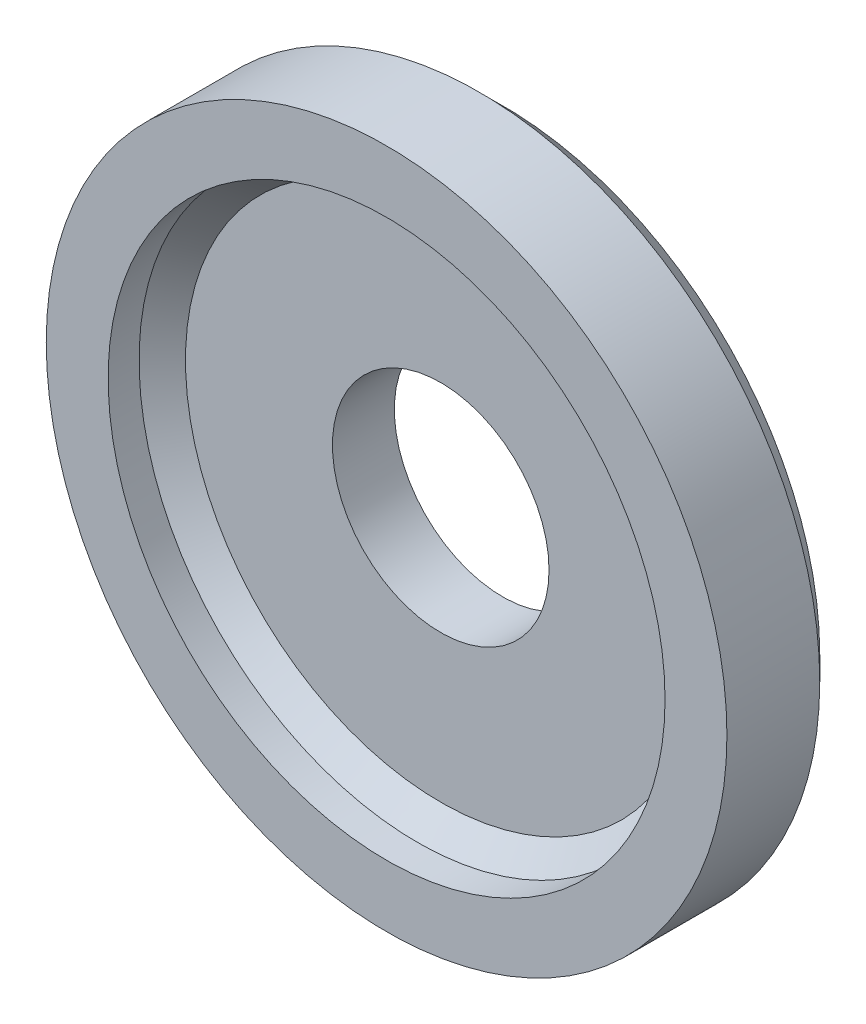
ISO-10303-21;
HEADER;
FILE_DESCRIPTION(('STEP AP214'),'2;1');
FILE_NAME('part.step','',(''),(''),'','','');
FILE_SCHEMA(('AUTOMOTIVE_DESIGN { 1 0 10303 214 1 1 1 1 }'));
ENDSEC;
DATA;
#1=APPLICATION_CONTEXT('core data for automotive mechanical design processes');
#2=APPLICATION_PROTOCOL_DEFINITION('international standard','automotive_design',2000,#1);
#3=PRODUCT_CONTEXT('',#1,'mechanical');
#4=PRODUCT('Part','Part','',(#3));
#5=PRODUCT_RELATED_PRODUCT_CATEGORY('part','',(#4));
#6=PRODUCT_DEFINITION_FORMATION('','',#4);
#7=PRODUCT_DEFINITION_CONTEXT('part definition',#1,'design');
#8=PRODUCT_DEFINITION('design','',#6,#7);
#9=PRODUCT_DEFINITION_SHAPE('','',#8);
#10=(LENGTH_UNIT() NAMED_UNIT(*) SI_UNIT(.MILLI.,.METRE.));
#11=(NAMED_UNIT(*) PLANE_ANGLE_UNIT() SI_UNIT($,.RADIAN.));
#12=(NAMED_UNIT(*) SI_UNIT($,.STERADIAN.) SOLID_ANGLE_UNIT());
#13=UNCERTAINTY_MEASURE_WITH_UNIT(LENGTH_MEASURE(1.E-05),#10,'distance_accuracy_value','');
#14=(GEOMETRIC_REPRESENTATION_CONTEXT(3) GLOBAL_UNCERTAINTY_ASSIGNED_CONTEXT((#13)) GLOBAL_UNIT_ASSIGNED_CONTEXT((#10,
#11,#12)) REPRESENTATION_CONTEXT('',''));
#15=CARTESIAN_POINT('',(0.,0.,0.));
#16=DIRECTION('',(0.,0.,1.));
#17=DIRECTION('',(1.,0.,0.));
#18=AXIS2_PLACEMENT_3D('',#15,#16,#17);
#19=CARTESIAN_POINT('',(0.,0.,3.75));
#20=DIRECTION('',(0.,0.,-1.));
#21=DIRECTION('',(-1.,0.,0.));
#22=AXIS2_PLACEMENT_3D('',#19,#20,#21);
#23=CYLINDRICAL_SURFACE('',#22,3.5);
#24=CARTESIAN_POINT('',(0.,0.,0.));
#25=DIRECTION('',(0.,0.,1.));
#26=DIRECTION('',(1.,0.,0.));
#27=AXIS2_PLACEMENT_3D('',#24,#25,#26);
#28=CIRCLE('',#27,3.5);
#29=CARTESIAN_POINT('',(3.5,0.,0.));
#30=VERTEX_POINT('',#29);
#31=EDGE_CURVE('E70',#30,#30,#28,.T.);
#32=ORIENTED_EDGE('',*,*,#31,.F.);
#33=EDGE_LOOP('',(#32));
#34=FACE_BOUND('',#33,.T.);
#35=CARTESIAN_POINT('',(0.,0.,2.));
#36=DIRECTION('',(0.,0.,1.));
#37=DIRECTION('',(1.,0.,0.));
#38=AXIS2_PLACEMENT_3D('',#35,#36,#37);
#39=CIRCLE('',#38,3.5);
#40=CARTESIAN_POINT('',(3.5,0.,2.));
#41=VERTEX_POINT('',#40);
#42=EDGE_CURVE('E67',#41,#41,#39,.T.);
#43=ORIENTED_EDGE('',*,*,#42,.T.);
#44=EDGE_LOOP('',(#43));
#45=FACE_BOUND('',#44,.T.);
#46=ADVANCED_FACE('F45',(#34,#45),#23,.F.);
#47=CARTESIAN_POINT('',(0.,0.,3.75));
#48=DIRECTION('',(0.,0.,1.));
#49=DIRECTION('',(1.,0.,0.));
#50=AXIS2_PLACEMENT_3D('',#47,#48,#49);
#51=PLANE('',#50);
#52=CARTESIAN_POINT('',(0.,0.,3.75));
#53=DIRECTION('',(0.,0.,1.));
#54=DIRECTION('',(1.,0.,0.));
#55=AXIS2_PLACEMENT_3D('',#52,#53,#54);
#56=CIRCLE('',#55,9.);
#57=CARTESIAN_POINT('',(9.,0.,3.75));
#58=VERTEX_POINT('',#57);
#59=EDGE_CURVE('E71',#58,#58,#56,.T.);
#60=ORIENTED_EDGE('',*,*,#59,.F.);
#61=EDGE_LOOP('',(#60));
#62=FACE_BOUND('',#61,.T.);
#63=CARTESIAN_POINT('',(0.,0.,3.75));
#64=DIRECTION('',(0.,0.,1.));
#65=DIRECTION('',(1.,0.,0.));
#66=AXIS2_PLACEMENT_3D('',#63,#64,#65);
#67=CIRCLE('',#66,11.);
#68=CARTESIAN_POINT('',(11.,0.,3.75));
#69=VERTEX_POINT('',#68);
#70=EDGE_CURVE('E76',#69,#69,#67,.T.);
#71=ORIENTED_EDGE('',*,*,#70,.T.);
#72=EDGE_LOOP('',(#71));
#73=FACE_BOUND('',#72,.T.);
#74=ADVANCED_FACE('F89',(#62,#73),#51,.T.);
#75=CARTESIAN_POINT('',(0.,0.,0.));
#76=DIRECTION('',(0.,0.,1.));
#77=DIRECTION('',(1.,0.,0.));
#78=AXIS2_PLACEMENT_3D('',#75,#76,#77);
#79=PLANE('',#78);
#80=CARTESIAN_POINT('',(0.,0.,0.));
#81=DIRECTION('',(0.,0.,1.));
#82=DIRECTION('',(1.,0.,0.));
#83=AXIS2_PLACEMENT_3D('',#80,#81,#82);
#84=CIRCLE('',#83,10.25);
#85=CARTESIAN_POINT('',(10.25,0.,0.));
#86=VERTEX_POINT('',#85);
#87=EDGE_CURVE('E59',#86,#86,#84,.F.);
#88=ORIENTED_EDGE('',*,*,#87,.T.);
#89=EDGE_LOOP('',(#88));
#90=FACE_BOUND('',#89,.T.);
#91=ORIENTED_EDGE('',*,*,#31,.T.);
#92=EDGE_LOOP('',(#91));
#93=FACE_BOUND('',#92,.T.);
#94=ADVANCED_FACE('F92',(#90,#93),#79,.F.);
#95=CARTESIAN_POINT('',(0.,0.,3.75));
#96=DIRECTION('',(0.,0.,-1.));
#97=DIRECTION('',(-1.,0.,0.));
#98=AXIS2_PLACEMENT_3D('',#95,#96,#97);
#99=CYLINDRICAL_SURFACE('',#98,11.);
#100=CARTESIAN_POINT('',(0.,0.,0.750000000000008));
#101=DIRECTION('',(0.,0.,1.));
#102=DIRECTION('',(1.,0.,0.));
#103=AXIS2_PLACEMENT_3D('',#100,#101,#102);
#104=CIRCLE('',#103,11.);
#105=CARTESIAN_POINT('',(11.,0.,0.750000000000008));
#106=VERTEX_POINT('',#105);
#107=EDGE_CURVE('E64',#106,#106,#104,.T.);
#108=ORIENTED_EDGE('',*,*,#107,.T.);
#109=EDGE_LOOP('',(#108));
#110=FACE_BOUND('',#109,.T.);
#111=ORIENTED_EDGE('',*,*,#70,.F.);
#112=EDGE_LOOP('',(#111));
#113=FACE_BOUND('',#112,.T.);
#114=ADVANCED_FACE('F96',(#110,#113),#99,.T.);
#115=CARTESIAN_POINT('',(0.,0.,0.750000000000008));
#116=DIRECTION('',(0.,0.,1.));
#117=DIRECTION('',(1.,0.,0.));
#118=AXIS2_PLACEMENT_3D('',#115,#116,#117);
#119=CONICAL_SURFACE('',#118,11.,0.785398163397451);
#120=ORIENTED_EDGE('',*,*,#87,.F.);
#121=EDGE_LOOP('',(#120));
#122=FACE_BOUND('',#121,.T.);
#123=ORIENTED_EDGE('',*,*,#107,.F.);
#124=EDGE_LOOP('',(#123));
#125=FACE_BOUND('',#124,.T.);
#126=ADVANCED_FACE('F98',(#122,#125),#119,.T.);
#127=CARTESIAN_POINT('',(0.,0.,2.));
#128=DIRECTION('',(0.,0.,1.));
#129=DIRECTION('',(1.,0.,0.));
#130=AXIS2_PLACEMENT_3D('',#127,#128,#129);
#131=CYLINDRICAL_SURFACE('',#130,9.);
#132=CARTESIAN_POINT('',(0.,0.,2.75));
#133=DIRECTION('',(0.,0.,1.));
#134=DIRECTION('',(1.,0.,0.));
#135=AXIS2_PLACEMENT_3D('',#132,#133,#134);
#136=CIRCLE('',#135,9.);
#137=CARTESIAN_POINT('',(9.,0.,2.75));
#138=VERTEX_POINT('',#137);
#139=EDGE_CURVE('E10',#138,#138,#136,.F.);
#140=ORIENTED_EDGE('',*,*,#139,.T.);
#141=EDGE_LOOP('',(#140));
#142=FACE_BOUND('',#141,.T.);
#143=ORIENTED_EDGE('',*,*,#59,.T.);
#144=EDGE_LOOP('',(#143));
#145=FACE_BOUND('',#144,.T.);
#146=ADVANCED_FACE('F87',(#142,#145),#131,.F.);
#147=CARTESIAN_POINT('',(0.,0.,2.));
#148=DIRECTION('',(0.,0.,1.));
#149=DIRECTION('',(1.,0.,0.));
#150=AXIS2_PLACEMENT_3D('',#147,#148,#149);
#151=PLANE('',#150);
#152=CARTESIAN_POINT('',(0.,0.,2.));
#153=DIRECTION('',(0.,0.,1.));
#154=DIRECTION('',(1.,0.,0.));
#155=AXIS2_PLACEMENT_3D('',#152,#153,#154);
#156=CIRCLE('',#155,8.24999999999999);
#157=CARTESIAN_POINT('',(8.24999999999999,0.,2.));
#158=VERTEX_POINT('',#157);
#159=EDGE_CURVE('E54',#158,#158,#156,.T.);
#160=ORIENTED_EDGE('',*,*,#159,.T.);
#161=EDGE_LOOP('',(#160));
#162=FACE_BOUND('',#161,.T.);
#163=ORIENTED_EDGE('',*,*,#42,.F.);
#164=EDGE_LOOP('',(#163));
#165=FACE_BOUND('',#164,.T.);
#166=ADVANCED_FACE('F118',(#162,#165),#151,.T.);
#167=CARTESIAN_POINT('',(0.,0.,2.));
#168=DIRECTION('',(0.,0.,1.));
#169=DIRECTION('',(1.,0.,0.));
#170=AXIS2_PLACEMENT_3D('',#167,#168,#169);
#171=CONICAL_SURFACE('',#170,8.24999999999999,0.785398163397454);
#172=ORIENTED_EDGE('',*,*,#139,.F.);
#173=EDGE_LOOP('',(#172));
#174=FACE_BOUND('',#173,.T.);
#175=ORIENTED_EDGE('',*,*,#159,.F.);
#176=EDGE_LOOP('',(#175));
#177=FACE_BOUND('',#176,.T.);
#178=ADVANCED_FACE('F48',(#174,#177),#171,.F.);
#179=CLOSED_SHELL('',(#46,#74,#94,#114,#126,#146,#166,#178));
#180=MANIFOLD_SOLID_BREP('B2',#179);
#181=ADVANCED_BREP_SHAPE_REPRESENTATION('',(#18,#180),#14);
#182=SHAPE_DEFINITION_REPRESENTATION(#9,#181);
ENDSEC;
END-ISO-10303-21;
